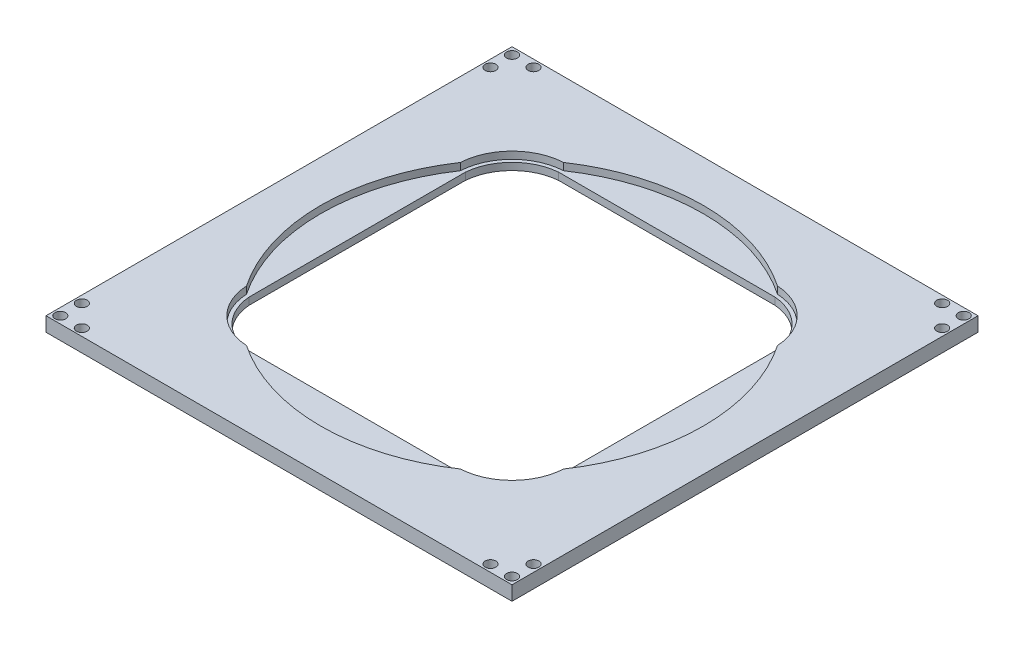
ISO-10303-21;
HEADER;
FILE_DESCRIPTION(('STEP AP214'),'2;1');
FILE_NAME('part.step','',(''),(''),'','','');
FILE_SCHEMA(('AUTOMOTIVE_DESIGN { 1 0 10303 214 1 1 1 1 }'));
ENDSEC;
DATA;
#1=APPLICATION_CONTEXT('core data for automotive mechanical design processes');
#2=APPLICATION_PROTOCOL_DEFINITION('international standard','automotive_design',2000,#1);
#3=PRODUCT_CONTEXT('',#1,'mechanical');
#4=PRODUCT('Part','Part','',(#3));
#5=PRODUCT_RELATED_PRODUCT_CATEGORY('part','',(#4));
#6=PRODUCT_DEFINITION_FORMATION('','',#4);
#7=PRODUCT_DEFINITION_CONTEXT('part definition',#1,'design');
#8=PRODUCT_DEFINITION('design','',#6,#7);
#9=PRODUCT_DEFINITION_SHAPE('','',#8);
#10=(LENGTH_UNIT() NAMED_UNIT(*) SI_UNIT(.MILLI.,.METRE.));
#11=(NAMED_UNIT(*) PLANE_ANGLE_UNIT() SI_UNIT($,.RADIAN.));
#12=(NAMED_UNIT(*) SI_UNIT($,.STERADIAN.) SOLID_ANGLE_UNIT());
#13=UNCERTAINTY_MEASURE_WITH_UNIT(LENGTH_MEASURE(1.E-05),#10,'distance_accuracy_value','');
#14=(GEOMETRIC_REPRESENTATION_CONTEXT(3) GLOBAL_UNCERTAINTY_ASSIGNED_CONTEXT((#13)) GLOBAL_UNIT_ASSIGNED_CONTEXT((#10,
#11,#12)) REPRESENTATION_CONTEXT('',''));
#15=CARTESIAN_POINT('',(0.,0.,0.));
#16=DIRECTION('',(0.,0.,1.));
#17=DIRECTION('',(1.,0.,0.));
#18=AXIS2_PLACEMENT_3D('',#15,#16,#17);
#19=CARTESIAN_POINT('',(65.,4.,-65.));
#20=DIRECTION('',(-1.,0.,0.));
#21=DIRECTION('',(0.,0.,1.));
#22=AXIS2_PLACEMENT_3D('',#19,#20,#21);
#23=PLANE('',#22);
#24=DIRECTION('',(0.,0.,-1.));
#25=VECTOR('',#24,1.);
#26=CARTESIAN_POINT('',(65.,0.,-65.));
#27=LINE('',#26,#25);
#28=CARTESIAN_POINT('',(65.,0.,65.));
#29=VERTEX_POINT('',#28);
#30=CARTESIAN_POINT('',(65.,0.,-65.));
#31=VERTEX_POINT('',#30);
#32=EDGE_CURVE('E307',#29,#31,#27,.T.);
#33=ORIENTED_EDGE('',*,*,#32,.T.);
#34=DIRECTION('',(0.,-1.,0.));
#35=VECTOR('',#34,1.);
#36=CARTESIAN_POINT('',(65.,4.,-65.));
#37=LINE('',#36,#35);
#38=CARTESIAN_POINT('',(65.,4.,-65.));
#39=VERTEX_POINT('',#38);
#40=EDGE_CURVE('E341',#39,#31,#37,.T.);
#41=ORIENTED_EDGE('',*,*,#40,.F.);
#42=DIRECTION('',(0.,0.,-1.));
#43=VECTOR('',#42,1.);
#44=CARTESIAN_POINT('',(65.,4.,-65.));
#45=LINE('',#44,#43);
#46=CARTESIAN_POINT('',(65.,4.,65.));
#47=VERTEX_POINT('',#46);
#48=EDGE_CURVE('E321',#47,#39,#45,.T.);
#49=ORIENTED_EDGE('',*,*,#48,.F.);
#50=DIRECTION('',(0.,-1.,0.));
#51=VECTOR('',#50,1.);
#52=CARTESIAN_POINT('',(65.,4.,65.));
#53=LINE('',#52,#51);
#54=EDGE_CURVE('E327',#47,#29,#53,.T.);
#55=ORIENTED_EDGE('',*,*,#54,.T.);
#56=EDGE_LOOP('',(#33,#41,#49,#55));
#57=FACE_BOUND('',#56,.T.);
#58=ADVANCED_FACE('F40',(#57),#23,.F.);
#59=CARTESIAN_POINT('',(-65.,4.,-65.));
#60=DIRECTION('',(0.,0.,1.));
#61=DIRECTION('',(1.,0.,0.));
#62=AXIS2_PLACEMENT_3D('',#59,#60,#61);
#63=PLANE('',#62);
#64=DIRECTION('',(-1.,0.,0.));
#65=VECTOR('',#64,1.);
#66=CARTESIAN_POINT('',(-65.,0.,-65.));
#67=LINE('',#66,#65);
#68=CARTESIAN_POINT('',(-65.,0.,-65.));
#69=VERTEX_POINT('',#68);
#70=EDGE_CURVE('E330',#31,#69,#67,.T.);
#71=ORIENTED_EDGE('',*,*,#70,.T.);
#72=DIRECTION('',(0.,-1.,0.));
#73=VECTOR('',#72,1.);
#74=CARTESIAN_POINT('',(-65.,4.,-65.));
#75=LINE('',#74,#73);
#76=CARTESIAN_POINT('',(-65.,4.,-65.));
#77=VERTEX_POINT('',#76);
#78=EDGE_CURVE('E338',#77,#69,#75,.T.);
#79=ORIENTED_EDGE('',*,*,#78,.F.);
#80=DIRECTION('',(-1.,0.,0.));
#81=VECTOR('',#80,1.);
#82=CARTESIAN_POINT('',(-65.,4.,-65.));
#83=LINE('',#82,#81);
#84=EDGE_CURVE('E91',#39,#77,#83,.T.);
#85=ORIENTED_EDGE('',*,*,#84,.F.);
#86=ORIENTED_EDGE('',*,*,#40,.T.);
#87=EDGE_LOOP('',(#71,#79,#85,#86));
#88=FACE_BOUND('',#87,.T.);
#89=ADVANCED_FACE('F387',(#88),#63,.F.);
#90=CARTESIAN_POINT('',(-65.,4.,-65.));
#91=DIRECTION('',(1.,0.,0.));
#92=DIRECTION('',(0.,0.,-1.));
#93=AXIS2_PLACEMENT_3D('',#90,#91,#92);
#94=PLANE('',#93);
#95=DIRECTION('',(0.,0.,1.));
#96=VECTOR('',#95,1.);
#97=CARTESIAN_POINT('',(-65.,0.,-65.));
#98=LINE('',#97,#96);
#99=CARTESIAN_POINT('',(-65.,0.,65.));
#100=VERTEX_POINT('',#99);
#101=EDGE_CURVE('E332',#69,#100,#98,.T.);
#102=ORIENTED_EDGE('',*,*,#101,.T.);
#103=DIRECTION('',(0.,-1.,0.));
#104=VECTOR('',#103,1.);
#105=CARTESIAN_POINT('',(-65.,4.,65.));
#106=LINE('',#105,#104);
#107=CARTESIAN_POINT('',(-65.,4.,65.));
#108=VERTEX_POINT('',#107);
#109=EDGE_CURVE('E336',#108,#100,#106,.T.);
#110=ORIENTED_EDGE('',*,*,#109,.F.);
#111=DIRECTION('',(0.,0.,1.));
#112=VECTOR('',#111,1.);
#113=CARTESIAN_POINT('',(-65.,4.,-65.));
#114=LINE('',#113,#112);
#115=EDGE_CURVE('E324',#77,#108,#114,.T.);
#116=ORIENTED_EDGE('',*,*,#115,.F.);
#117=ORIENTED_EDGE('',*,*,#78,.T.);
#118=EDGE_LOOP('',(#102,#110,#116,#117));
#119=FACE_BOUND('',#118,.T.);
#120=ADVANCED_FACE('F392',(#119),#94,.F.);
#121=CARTESIAN_POINT('',(-65.,4.,65.));
#122=DIRECTION('',(0.,0.,-1.));
#123=DIRECTION('',(-1.,0.,0.));
#124=AXIS2_PLACEMENT_3D('',#121,#122,#123);
#125=PLANE('',#124);
#126=DIRECTION('',(1.,0.,0.));
#127=VECTOR('',#126,1.);
#128=CARTESIAN_POINT('',(-65.,0.,65.));
#129=LINE('',#128,#127);
#130=EDGE_CURVE('E83',#100,#29,#129,.T.);
#131=ORIENTED_EDGE('',*,*,#130,.T.);
#132=ORIENTED_EDGE('',*,*,#54,.F.);
#133=DIRECTION('',(1.,0.,0.));
#134=VECTOR('',#133,1.);
#135=CARTESIAN_POINT('',(-65.,4.,65.));
#136=LINE('',#135,#134);
#137=EDGE_CURVE('E62',#108,#47,#136,.T.);
#138=ORIENTED_EDGE('',*,*,#137,.F.);
#139=ORIENTED_EDGE('',*,*,#109,.T.);
#140=EDGE_LOOP('',(#131,#132,#138,#139));
#141=FACE_BOUND('',#140,.T.);
#142=ADVANCED_FACE('F401',(#141),#125,.F.);
#143=CARTESIAN_POINT('',(0.,4.,0.));
#144=DIRECTION('',(0.,1.,0.));
#145=DIRECTION('',(0.,0.,1.));
#146=AXIS2_PLACEMENT_3D('',#143,#144,#145);
#147=PLANE('',#146);
#148=CARTESIAN_POINT('',(-62.9999999999998,4.,57.0000000000002));
#149=DIRECTION('',(0.,1.,0.));
#150=DIRECTION('',(1.,0.,0.));
#151=AXIS2_PLACEMENT_3D('',#148,#149,#150);
#152=CIRCLE('',#151,1.5);
#153=CARTESIAN_POINT('',(-61.4999999999998,4.,57.0000000000002));
#154=VERTEX_POINT('',#153);
#155=EDGE_CURVE('E713',#154,#154,#152,.T.);
#156=ORIENTED_EDGE('',*,*,#155,.F.);
#157=EDGE_LOOP('',(#156));
#158=FACE_BOUND('',#157,.T.);
#159=CARTESIAN_POINT('',(-56.9999999999998,4.,63.0000000000002));
#160=DIRECTION('',(0.,1.,0.));
#161=DIRECTION('',(1.,0.,0.));
#162=AXIS2_PLACEMENT_3D('',#159,#160,#161);
#163=CIRCLE('',#162,1.5);
#164=CARTESIAN_POINT('',(-55.4999999999998,4.,63.0000000000002));
#165=VERTEX_POINT('',#164);
#166=EDGE_CURVE('E719',#165,#165,#163,.T.);
#167=ORIENTED_EDGE('',*,*,#166,.F.);
#168=EDGE_LOOP('',(#167));
#169=FACE_BOUND('',#168,.T.);
#170=CARTESIAN_POINT('',(63.,4.,63.));
#171=DIRECTION('',(0.,1.,0.));
#172=DIRECTION('',(0.,0.,-1.));
#173=AXIS2_PLACEMENT_3D('',#170,#171,#172);
#174=CIRCLE('',#173,1.5);
#175=CARTESIAN_POINT('',(63.,4.,61.5));
#176=VERTEX_POINT('',#175);
#177=EDGE_CURVE('E728',#176,#176,#174,.T.);
#178=ORIENTED_EDGE('',*,*,#177,.F.);
#179=EDGE_LOOP('',(#178));
#180=FACE_BOUND('',#179,.T.);
#181=CARTESIAN_POINT('',(57.,4.,63.));
#182=DIRECTION('',(0.,1.,0.));
#183=DIRECTION('',(0.,0.,-1.));
#184=AXIS2_PLACEMENT_3D('',#181,#182,#183);
#185=CIRCLE('',#184,1.5);
#186=CARTESIAN_POINT('',(57.,4.,61.5));
#187=VERTEX_POINT('',#186);
#188=EDGE_CURVE('E734',#187,#187,#185,.T.);
#189=ORIENTED_EDGE('',*,*,#188,.F.);
#190=EDGE_LOOP('',(#189));
#191=FACE_BOUND('',#190,.T.);
#192=CARTESIAN_POINT('',(56.9999999999993,4.,-63.0000000000006));
#193=DIRECTION('',(0.,1.,0.));
#194=DIRECTION('',(-1.,0.,0.));
#195=AXIS2_PLACEMENT_3D('',#192,#193,#194);
#196=CIRCLE('',#195,1.5);
#197=CARTESIAN_POINT('',(55.4999999999993,4.,-63.0000000000006));
#198=VERTEX_POINT('',#197);
#199=EDGE_CURVE('E786',#198,#198,#196,.T.);
#200=ORIENTED_EDGE('',*,*,#199,.F.);
#201=EDGE_LOOP('',(#200));
#202=FACE_BOUND('',#201,.T.);
#203=CARTESIAN_POINT('',(62.9999999999994,4.,-57.0000000000007));
#204=DIRECTION('',(0.,1.,0.));
#205=DIRECTION('',(-1.,0.,0.));
#206=AXIS2_PLACEMENT_3D('',#203,#204,#205);
#207=CIRCLE('',#206,1.5);
#208=CARTESIAN_POINT('',(61.4999999999994,4.,-57.0000000000007));
#209=VERTEX_POINT('',#208);
#210=EDGE_CURVE('E796',#209,#209,#207,.T.);
#211=ORIENTED_EDGE('',*,*,#210,.F.);
#212=EDGE_LOOP('',(#211));
#213=FACE_BOUND('',#212,.T.);
#214=CARTESIAN_POINT('',(62.9999999999993,4.,-63.0000000000007));
#215=DIRECTION('',(0.,1.,0.));
#216=DIRECTION('',(-1.,0.,0.));
#217=AXIS2_PLACEMENT_3D('',#214,#215,#216);
#218=CIRCLE('',#217,1.5);
#219=CARTESIAN_POINT('',(61.4999999999993,4.,-63.0000000000007));
#220=VERTEX_POINT('',#219);
#221=EDGE_CURVE('E790',#220,#220,#218,.T.);
#222=ORIENTED_EDGE('',*,*,#221,.F.);
#223=EDGE_LOOP('',(#222));
#224=FACE_BOUND('',#223,.T.);
#225=CARTESIAN_POINT('',(63.,4.,57.));
#226=DIRECTION('',(0.,1.,0.));
#227=DIRECTION('',(0.,0.,-1.));
#228=AXIS2_PLACEMENT_3D('',#225,#226,#227);
#229=CIRCLE('',#228,1.5);
#230=CARTESIAN_POINT('',(63.,4.,55.5));
#231=VERTEX_POINT('',#230);
#232=EDGE_CURVE('E778',#231,#231,#229,.T.);
#233=ORIENTED_EDGE('',*,*,#232,.F.);
#234=EDGE_LOOP('',(#233));
#235=FACE_BOUND('',#234,.T.);
#236=CARTESIAN_POINT('',(-62.9999999999998,4.,63.0000000000002));
#237=DIRECTION('',(0.,1.,0.));
#238=DIRECTION('',(1.,0.,0.));
#239=AXIS2_PLACEMENT_3D('',#236,#237,#238);
#240=CIRCLE('',#239,1.5);
#241=CARTESIAN_POINT('',(-61.4999999999998,4.,63.0000000000002));
#242=VERTEX_POINT('',#241);
#243=EDGE_CURVE('E716',#242,#242,#240,.T.);
#244=ORIENTED_EDGE('',*,*,#243,.F.);
#245=EDGE_LOOP('',(#244));
#246=FACE_BOUND('',#245,.T.);
#247=CARTESIAN_POINT('',(-63.,4.,-57.));
#248=DIRECTION('',(0.,1.,0.));
#249=DIRECTION('',(0.,0.,1.));
#250=AXIS2_PLACEMENT_3D('',#247,#248,#249);
#251=CIRCLE('',#250,1.5);
#252=CARTESIAN_POINT('',(-63.,4.,-55.5));
#253=VERTEX_POINT('',#252);
#254=EDGE_CURVE('E741',#253,#253,#251,.T.);
#255=ORIENTED_EDGE('',*,*,#254,.F.);
#256=EDGE_LOOP('',(#255));
#257=FACE_BOUND('',#256,.T.);
#258=CARTESIAN_POINT('',(-57.,4.,-63.));
#259=DIRECTION('',(0.,1.,0.));
#260=DIRECTION('',(0.,0.,1.));
#261=AXIS2_PLACEMENT_3D('',#258,#259,#260);
#262=CIRCLE('',#261,1.5);
#263=CARTESIAN_POINT('',(-57.,4.,-61.5));
#264=VERTEX_POINT('',#263);
#265=EDGE_CURVE('E747',#264,#264,#262,.T.);
#266=ORIENTED_EDGE('',*,*,#265,.F.);
#267=EDGE_LOOP('',(#266));
#268=FACE_BOUND('',#267,.T.);
#269=CARTESIAN_POINT('',(-63.,4.,-63.));
#270=DIRECTION('',(0.,1.,0.));
#271=DIRECTION('',(0.,0.,1.));
#272=AXIS2_PLACEMENT_3D('',#269,#270,#271);
#273=CIRCLE('',#272,1.5);
#274=CARTESIAN_POINT('',(-63.,4.,-61.5));
#275=VERTEX_POINT('',#274);
#276=EDGE_CURVE('E219',#275,#275,#273,.T.);
#277=ORIENTED_EDGE('',*,*,#276,.F.);
#278=EDGE_LOOP('',(#277));
#279=FACE_BOUND('',#278,.T.);
#280=CARTESIAN_POINT('',(28.9999999999999,4.,-29.));
#281=DIRECTION('',(0.,1.,0.));
#282=DIRECTION('',(0.,0.,1.));
#283=AXIS2_PLACEMENT_3D('',#280,#281,#282);
#284=CIRCLE('',#283,15.25);
#285=CARTESIAN_POINT('',(44.2270660839662,4.,-29.8360373643096));
#286=VERTEX_POINT('',#285);
#287=CARTESIAN_POINT('',(29.8360373643095,4.,-44.2270660839664));
#288=VERTEX_POINT('',#287);
#289=EDGE_CURVE('E283',#286,#288,#284,.T.);
#290=ORIENTED_EDGE('',*,*,#289,.F.);
#291=CARTESIAN_POINT('',(0.,4.,0.));
#292=DIRECTION('',(0.,1.,0.));
#293=DIRECTION('',(0.,0.,1.));
#294=AXIS2_PLACEMENT_3D('',#291,#292,#293);
#295=CIRCLE('',#294,53.35);
#296=CARTESIAN_POINT('',(44.2270660839663,4.,29.8360373643095));
#297=VERTEX_POINT('',#296);
#298=EDGE_CURVE('E302',#297,#286,#295,.T.);
#299=ORIENTED_EDGE('',*,*,#298,.F.);
#300=CARTESIAN_POINT('',(29.,4.,28.9999999999998));
#301=DIRECTION('',(0.,1.,0.));
#302=DIRECTION('',(0.,0.,1.));
#303=AXIS2_PLACEMENT_3D('',#300,#301,#302);
#304=CIRCLE('',#303,15.25);
#305=CARTESIAN_POINT('',(29.8360373643098,4.,44.2270660839661));
#306=VERTEX_POINT('',#305);
#307=EDGE_CURVE('E299',#306,#297,#304,.T.);
#308=ORIENTED_EDGE('',*,*,#307,.F.);
#309=CARTESIAN_POINT('',(0.,4.,0.));
#310=DIRECTION('',(0.,1.,0.));
#311=DIRECTION('',(0.,0.,1.));
#312=AXIS2_PLACEMENT_3D('',#309,#310,#311);
#313=CIRCLE('',#312,53.35);
#314=CARTESIAN_POINT('',(-29.8360373643098,4.,44.2270660839662));
#315=VERTEX_POINT('',#314);
#316=EDGE_CURVE('E296',#315,#306,#313,.T.);
#317=ORIENTED_EDGE('',*,*,#316,.F.);
#318=CARTESIAN_POINT('',(-29.,4.,28.9999999999998));
#319=DIRECTION('',(0.,1.,0.));
#320=DIRECTION('',(0.,0.,1.));
#321=AXIS2_PLACEMENT_3D('',#318,#319,#320);
#322=CIRCLE('',#321,15.25);
#323=CARTESIAN_POINT('',(-44.2270660839664,4.,29.8360373643095));
#324=VERTEX_POINT('',#323);
#325=EDGE_CURVE('E293',#324,#315,#322,.T.);
#326=ORIENTED_EDGE('',*,*,#325,.F.);
#327=CARTESIAN_POINT('',(0.,4.,0.));
#328=DIRECTION('',(0.,1.,0.));
#329=DIRECTION('',(0.,0.,1.));
#330=AXIS2_PLACEMENT_3D('',#327,#328,#329);
#331=CIRCLE('',#330,53.35);
#332=CARTESIAN_POINT('',(-44.2270660839665,4.,-29.8360373643094));
#333=VERTEX_POINT('',#332);
#334=EDGE_CURVE('E290',#333,#324,#331,.T.);
#335=ORIENTED_EDGE('',*,*,#334,.F.);
#336=CARTESIAN_POINT('',(-29.0000000000001,4.,-29.));
#337=DIRECTION('',(0.,1.,0.));
#338=DIRECTION('',(0.,0.,1.));
#339=AXIS2_PLACEMENT_3D('',#336,#337,#338);
#340=CIRCLE('',#339,15.25);
#341=CARTESIAN_POINT('',(-29.8360373643095,4.,-44.2270660839664));
#342=VERTEX_POINT('',#341);
#343=EDGE_CURVE('E287',#342,#333,#340,.T.);
#344=ORIENTED_EDGE('',*,*,#343,.F.);
#345=CARTESIAN_POINT('',(0.,4.,0.));
#346=DIRECTION('',(0.,1.,0.));
#347=DIRECTION('',(0.,0.,1.));
#348=AXIS2_PLACEMENT_3D('',#345,#346,#347);
#349=CIRCLE('',#348,53.35);
#350=EDGE_CURVE('E285',#288,#342,#349,.T.);
#351=ORIENTED_EDGE('',*,*,#350,.F.);
#352=EDGE_LOOP('',(#290,#299,#308,#317,#326,#335,#344,#351));
#353=FACE_BOUND('',#352,.T.);
#354=ORIENTED_EDGE('',*,*,#48,.T.);
#355=ORIENTED_EDGE('',*,*,#84,.T.);
#356=ORIENTED_EDGE('',*,*,#115,.T.);
#357=ORIENTED_EDGE('',*,*,#137,.T.);
#358=EDGE_LOOP('',(#354,#355,#356,#357));
#359=FACE_BOUND('',#358,.T.);
#360=ADVANCED_FACE('F359',(#158,#169,#180,#191,#202,#213,#224,#235,#246,#257,#268,#279,#353,
#359),#147,.T.);
#361=CARTESIAN_POINT('',(0.,0.,0.));
#362=DIRECTION('',(0.,1.,0.));
#363=DIRECTION('',(0.,0.,1.));
#364=AXIS2_PLACEMENT_3D('',#361,#362,#363);
#365=PLANE('',#364);
#366=CARTESIAN_POINT('',(-62.9999999999998,0.,57.0000000000002));
#367=DIRECTION('',(0.,1.,0.));
#368=DIRECTION('',(1.,0.,0.));
#369=AXIS2_PLACEMENT_3D('',#366,#367,#368);
#370=CIRCLE('',#369,1.5);
#371=CARTESIAN_POINT('',(-61.4999999999998,0.,57.0000000000002));
#372=VERTEX_POINT('',#371);
#373=EDGE_CURVE('E711',#372,#372,#370,.T.);
#374=ORIENTED_EDGE('',*,*,#373,.T.);
#375=EDGE_LOOP('',(#374));
#376=FACE_BOUND('',#375,.T.);
#377=CARTESIAN_POINT('',(-56.9999999999998,0.,63.0000000000002));
#378=DIRECTION('',(0.,1.,0.));
#379=DIRECTION('',(1.,0.,0.));
#380=AXIS2_PLACEMENT_3D('',#377,#378,#379);
#381=CIRCLE('',#380,1.5);
#382=CARTESIAN_POINT('',(-55.4999999999998,0.,63.0000000000002));
#383=VERTEX_POINT('',#382);
#384=EDGE_CURVE('E714',#383,#383,#381,.T.);
#385=ORIENTED_EDGE('',*,*,#384,.T.);
#386=EDGE_LOOP('',(#385));
#387=FACE_BOUND('',#386,.T.);
#388=CARTESIAN_POINT('',(63.,0.,63.));
#389=DIRECTION('',(0.,1.,0.));
#390=DIRECTION('',(0.,0.,-1.));
#391=AXIS2_PLACEMENT_3D('',#388,#389,#390);
#392=CIRCLE('',#391,1.5);
#393=CARTESIAN_POINT('',(63.,0.,61.5));
#394=VERTEX_POINT('',#393);
#395=EDGE_CURVE('E725',#394,#394,#392,.T.);
#396=ORIENTED_EDGE('',*,*,#395,.T.);
#397=EDGE_LOOP('',(#396));
#398=FACE_BOUND('',#397,.T.);
#399=CARTESIAN_POINT('',(57.,0.,63.));
#400=DIRECTION('',(0.,1.,0.));
#401=DIRECTION('',(0.,0.,-1.));
#402=AXIS2_PLACEMENT_3D('',#399,#400,#401);
#403=CIRCLE('',#402,1.5);
#404=CARTESIAN_POINT('',(57.,0.,61.5));
#405=VERTEX_POINT('',#404);
#406=EDGE_CURVE('E731',#405,#405,#403,.T.);
#407=ORIENTED_EDGE('',*,*,#406,.T.);
#408=EDGE_LOOP('',(#407));
#409=FACE_BOUND('',#408,.T.);
#410=CARTESIAN_POINT('',(56.9999999999993,0.,-63.0000000000006));
#411=DIRECTION('',(0.,1.,0.));
#412=DIRECTION('',(-1.,0.,0.));
#413=AXIS2_PLACEMENT_3D('',#410,#411,#412);
#414=CIRCLE('',#413,1.5);
#415=CARTESIAN_POINT('',(55.4999999999993,0.,-63.0000000000006));
#416=VERTEX_POINT('',#415);
#417=EDGE_CURVE('E801',#416,#416,#414,.T.);
#418=ORIENTED_EDGE('',*,*,#417,.T.);
#419=EDGE_LOOP('',(#418));
#420=FACE_BOUND('',#419,.T.);
#421=CARTESIAN_POINT('',(62.9999999999994,0.,-57.0000000000007));
#422=DIRECTION('',(0.,1.,0.));
#423=DIRECTION('',(-1.,0.,0.));
#424=AXIS2_PLACEMENT_3D('',#421,#422,#423);
#425=CIRCLE('',#424,1.5);
#426=CARTESIAN_POINT('',(61.4999999999994,0.,-57.0000000000007));
#427=VERTEX_POINT('',#426);
#428=EDGE_CURVE('E792',#427,#427,#425,.T.);
#429=ORIENTED_EDGE('',*,*,#428,.T.);
#430=EDGE_LOOP('',(#429));
#431=FACE_BOUND('',#430,.T.);
#432=CARTESIAN_POINT('',(62.9999999999993,0.,-63.0000000000007));
#433=DIRECTION('',(0.,1.,0.));
#434=DIRECTION('',(-1.,0.,0.));
#435=AXIS2_PLACEMENT_3D('',#432,#433,#434);
#436=CIRCLE('',#435,1.5);
#437=CARTESIAN_POINT('',(61.4999999999993,0.,-63.0000000000007));
#438=VERTEX_POINT('',#437);
#439=EDGE_CURVE('E783',#438,#438,#436,.T.);
#440=ORIENTED_EDGE('',*,*,#439,.T.);
#441=EDGE_LOOP('',(#440));
#442=FACE_BOUND('',#441,.T.);
#443=CARTESIAN_POINT('',(63.,0.,57.));
#444=DIRECTION('',(0.,1.,0.));
#445=DIRECTION('',(0.,0.,-1.));
#446=AXIS2_PLACEMENT_3D('',#443,#444,#445);
#447=CIRCLE('',#446,1.5);
#448=CARTESIAN_POINT('',(63.,0.,55.5));
#449=VERTEX_POINT('',#448);
#450=EDGE_CURVE('E737',#449,#449,#447,.T.);
#451=ORIENTED_EDGE('',*,*,#450,.T.);
#452=EDGE_LOOP('',(#451));
#453=FACE_BOUND('',#452,.T.);
#454=CARTESIAN_POINT('',(-62.9999999999998,0.,63.0000000000002));
#455=DIRECTION('',(0.,1.,0.));
#456=DIRECTION('',(1.,0.,0.));
#457=AXIS2_PLACEMENT_3D('',#454,#455,#456);
#458=CIRCLE('',#457,1.5);
#459=CARTESIAN_POINT('',(-61.4999999999998,0.,63.0000000000002));
#460=VERTEX_POINT('',#459);
#461=EDGE_CURVE('E738',#460,#460,#458,.T.);
#462=ORIENTED_EDGE('',*,*,#461,.T.);
#463=EDGE_LOOP('',(#462));
#464=FACE_BOUND('',#463,.T.);
#465=CARTESIAN_POINT('',(-63.,0.,-57.));
#466=DIRECTION('',(0.,1.,0.));
#467=DIRECTION('',(0.,0.,1.));
#468=AXIS2_PLACEMENT_3D('',#465,#466,#467);
#469=CIRCLE('',#468,1.5);
#470=CARTESIAN_POINT('',(-63.,0.,-55.5));
#471=VERTEX_POINT('',#470);
#472=EDGE_CURVE('E750',#471,#471,#469,.T.);
#473=ORIENTED_EDGE('',*,*,#472,.T.);
#474=EDGE_LOOP('',(#473));
#475=FACE_BOUND('',#474,.T.);
#476=CARTESIAN_POINT('',(-57.,0.,-63.));
#477=DIRECTION('',(0.,1.,0.));
#478=DIRECTION('',(0.,0.,1.));
#479=AXIS2_PLACEMENT_3D('',#476,#477,#478);
#480=CIRCLE('',#479,1.5);
#481=CARTESIAN_POINT('',(-57.,0.,-61.5));
#482=VERTEX_POINT('',#481);
#483=EDGE_CURVE('E744',#482,#482,#480,.T.);
#484=ORIENTED_EDGE('',*,*,#483,.T.);
#485=EDGE_LOOP('',(#484));
#486=FACE_BOUND('',#485,.T.);
#487=CARTESIAN_POINT('',(-63.,0.,-63.));
#488=DIRECTION('',(0.,1.,0.));
#489=DIRECTION('',(0.,0.,1.));
#490=AXIS2_PLACEMENT_3D('',#487,#488,#489);
#491=CIRCLE('',#490,1.5);
#492=CARTESIAN_POINT('',(-63.,0.,-61.5));
#493=VERTEX_POINT('',#492);
#494=EDGE_CURVE('E214',#493,#493,#491,.T.);
#495=ORIENTED_EDGE('',*,*,#494,.T.);
#496=EDGE_LOOP('',(#495));
#497=FACE_BOUND('',#496,.T.);
#498=CARTESIAN_POINT('',(-29.,0.,28.9999999999998));
#499=DIRECTION('',(0.,1.,0.));
#500=DIRECTION('',(0.,0.,1.));
#501=AXIS2_PLACEMENT_3D('',#498,#499,#500);
#502=CIRCLE('',#501,14.2379176797096);
#503=CARTESIAN_POINT('',(-43.1898464071789,0.,30.1689990568263));
#504=VERTEX_POINT('',#503);
#505=CARTESIAN_POINT('',(-30.1689990568201,0.,43.1898464071792));
#506=VERTEX_POINT('',#505);
#507=EDGE_CURVE('E231',#504,#506,#502,.T.);
#508=ORIENTED_EDGE('',*,*,#507,.T.);
#509=DIRECTION('',(1.,0.,0.));
#510=VECTOR('',#509,1.);
#511=CARTESIAN_POINT('',(-30.1689990568259,0.,43.1898464071792));
#512=LINE('',#511,#510);
#513=CARTESIAN_POINT('',(30.1689990568258,0.,43.1898464071792));
#514=VERTEX_POINT('',#513);
#515=EDGE_CURVE('E268',#506,#514,#512,.T.);
#516=ORIENTED_EDGE('',*,*,#515,.T.);
#517=CARTESIAN_POINT('',(28.9999999999999,0.,28.9999999999999));
#518=DIRECTION('',(0.,1.,0.));
#519=DIRECTION('',(1.,0.,0.));
#520=AXIS2_PLACEMENT_3D('',#517,#518,#519);
#521=CIRCLE('',#520,14.2379176797096);
#522=CARTESIAN_POINT('',(43.1898464071793,0.,30.16899905682));
#523=VERTEX_POINT('',#522);
#524=EDGE_CURVE('E226',#514,#523,#521,.T.);
#525=ORIENTED_EDGE('',*,*,#524,.T.);
#526=DIRECTION('',(0.,0.,-1.));
#527=VECTOR('',#526,1.);
#528=CARTESIAN_POINT('',(43.1898464071793,0.,30.1689990568257));
#529=LINE('',#528,#527);
#530=CARTESIAN_POINT('',(43.1898464071791,0.,-30.168999056826));
#531=VERTEX_POINT('',#530);
#532=EDGE_CURVE('E252',#523,#531,#529,.T.);
#533=ORIENTED_EDGE('',*,*,#532,.T.);
#534=CARTESIAN_POINT('',(29.,0.,-28.9999999999998));
#535=DIRECTION('',(0.,1.,0.));
#536=DIRECTION('',(0.,0.,-1.));
#537=AXIS2_PLACEMENT_3D('',#534,#535,#536);
#538=CIRCLE('',#537,14.2379176797096);
#539=CARTESIAN_POINT('',(30.1689990568201,0.,-43.1898464071792));
#540=VERTEX_POINT('',#539);
#541=EDGE_CURVE('E216',#531,#540,#538,.T.);
#542=ORIENTED_EDGE('',*,*,#541,.T.);
#543=DIRECTION('',(-1.,0.,0.));
#544=VECTOR('',#543,1.);
#545=CARTESIAN_POINT('',(30.1689990568259,0.,-43.1898464071792));
#546=LINE('',#545,#544);
#547=CARTESIAN_POINT('',(-30.1689990568258,0.,-43.1898464071792));
#548=VERTEX_POINT('',#547);
#549=EDGE_CURVE('E213',#540,#548,#546,.T.);
#550=ORIENTED_EDGE('',*,*,#549,.T.);
#551=CARTESIAN_POINT('',(-29.0000000000001,0.,-28.9999999999997));
#552=DIRECTION('',(0.,1.,0.));
#553=DIRECTION('',(-1.,0.,0.));
#554=AXIS2_PLACEMENT_3D('',#551,#552,#553);
#555=CIRCLE('',#554,14.2379176797096);
#556=CARTESIAN_POINT('',(-43.1898464071795,0.,-30.1689990568197));
#557=VERTEX_POINT('',#556);
#558=EDGE_CURVE('E205',#548,#557,#555,.T.);
#559=ORIENTED_EDGE('',*,*,#558,.T.);
#560=DIRECTION('',(0.,0.,1.));
#561=VECTOR('',#560,1.);
#562=CARTESIAN_POINT('',(-43.1898464071795,0.,-30.1689990568254));
#563=LINE('',#562,#561);
#564=EDGE_CURVE('E187',#557,#504,#563,.T.);
#565=ORIENTED_EDGE('',*,*,#564,.T.);
#566=EDGE_LOOP('',(#508,#516,#525,#533,#542,#550,#559,#565));
#567=FACE_BOUND('',#566,.T.);
#568=ORIENTED_EDGE('',*,*,#32,.F.);
#569=ORIENTED_EDGE('',*,*,#130,.F.);
#570=ORIENTED_EDGE('',*,*,#101,.F.);
#571=ORIENTED_EDGE('',*,*,#70,.F.);
#572=EDGE_LOOP('',(#568,#569,#570,#571));
#573=FACE_BOUND('',#572,.T.);
#574=ADVANCED_FACE('F210',(#376,#387,#398,#409,#420,#431,#442,#453,#464,#475,#486,#497,#567,
#573),#365,.F.);
#575=CARTESIAN_POINT('',(28.9999999999999,0.,-29.));
#576=DIRECTION('',(0.,1.,0.));
#577=DIRECTION('',(0.,0.,1.));
#578=AXIS2_PLACEMENT_3D('',#575,#576,#577);
#579=CYLINDRICAL_SURFACE('',#578,15.25);
#580=DIRECTION('',(0.,1.,0.));
#581=VECTOR('',#580,1.);
#582=CARTESIAN_POINT('',(29.8360373643095,0.,-44.2270660839664));
#583=LINE('',#582,#581);
#584=CARTESIAN_POINT('',(29.8360373643095,2.,-44.2270660839664));
#585=VERTEX_POINT('',#584);
#586=EDGE_CURVE('E53',#585,#288,#583,.T.);
#587=ORIENTED_EDGE('',*,*,#586,.F.);
#588=CARTESIAN_POINT('',(28.9999999999999,2.,-29.));
#589=DIRECTION('',(0.,1.,0.));
#590=DIRECTION('',(0.,0.,1.));
#591=AXIS2_PLACEMENT_3D('',#588,#589,#590);
#592=CIRCLE('',#591,15.25);
#593=CARTESIAN_POINT('',(44.2270660839662,2.,-29.8360373643096));
#594=VERTEX_POINT('',#593);
#595=EDGE_CURVE('E265',#585,#594,#592,.F.);
#596=ORIENTED_EDGE('',*,*,#595,.T.);
#597=DIRECTION('',(0.,1.,0.));
#598=VECTOR('',#597,1.);
#599=CARTESIAN_POINT('',(44.2270660839662,0.,-29.8360373643096));
#600=LINE('',#599,#598);
#601=EDGE_CURVE('E305',#594,#286,#600,.T.);
#602=ORIENTED_EDGE('',*,*,#601,.T.);
#603=ORIENTED_EDGE('',*,*,#289,.T.);
#604=EDGE_LOOP('',(#587,#596,#602,#603));
#605=FACE_BOUND('',#604,.T.);
#606=ADVANCED_FACE('F372',(#605),#579,.F.);
#607=CARTESIAN_POINT('',(0.,0.,0.));
#608=DIRECTION('',(0.,1.,0.));
#609=DIRECTION('',(0.,0.,1.));
#610=AXIS2_PLACEMENT_3D('',#607,#608,#609);
#611=CYLINDRICAL_SURFACE('',#610,53.35);
#612=ORIENTED_EDGE('',*,*,#601,.F.);
#613=CARTESIAN_POINT('',(0.,2.,0.));
#614=DIRECTION('',(0.,1.,0.));
#615=DIRECTION('',(0.,0.,1.));
#616=AXIS2_PLACEMENT_3D('',#613,#614,#615);
#617=CIRCLE('',#616,53.35);
#618=CARTESIAN_POINT('',(44.2270660839664,2.,29.8360373643095));
#619=VERTEX_POINT('',#618);
#620=EDGE_CURVE('E260',#594,#619,#617,.F.);
#621=ORIENTED_EDGE('',*,*,#620,.T.);
#622=DIRECTION('',(0.,1.,0.));
#623=VECTOR('',#622,1.);
#624=CARTESIAN_POINT('',(44.2270660839663,0.,29.8360373643095));
#625=LINE('',#624,#623);
#626=EDGE_CURVE('E308',#619,#297,#625,.T.);
#627=ORIENTED_EDGE('',*,*,#626,.T.);
#628=ORIENTED_EDGE('',*,*,#298,.T.);
#629=EDGE_LOOP('',(#612,#621,#627,#628));
#630=FACE_BOUND('',#629,.T.);
#631=ADVANCED_FACE('F370',(#630),#611,.F.);
#632=CARTESIAN_POINT('',(29.,0.,28.9999999999998));
#633=DIRECTION('',(0.,1.,0.));
#634=DIRECTION('',(0.,0.,1.));
#635=AXIS2_PLACEMENT_3D('',#632,#633,#634);
#636=CYLINDRICAL_SURFACE('',#635,15.25);
#637=ORIENTED_EDGE('',*,*,#626,.F.);
#638=CARTESIAN_POINT('',(29.,2.,28.9999999999998));
#639=DIRECTION('',(0.,1.,0.));
#640=DIRECTION('',(0.,0.,1.));
#641=AXIS2_PLACEMENT_3D('',#638,#639,#640);
#642=CIRCLE('',#641,15.25);
#643=CARTESIAN_POINT('',(29.8360373643098,2.,44.2270660839661));
#644=VERTEX_POINT('',#643);
#645=EDGE_CURVE('E280',#619,#644,#642,.F.);
#646=ORIENTED_EDGE('',*,*,#645,.T.);
#647=DIRECTION('',(0.,1.,0.));
#648=VECTOR('',#647,1.);
#649=CARTESIAN_POINT('',(29.8360373643098,0.,44.2270660839661));
#650=LINE('',#649,#648);
#651=EDGE_CURVE('E310',#644,#306,#650,.T.);
#652=ORIENTED_EDGE('',*,*,#651,.T.);
#653=ORIENTED_EDGE('',*,*,#307,.T.);
#654=EDGE_LOOP('',(#637,#646,#652,#653));
#655=FACE_BOUND('',#654,.T.);
#656=ADVANCED_FACE('F367',(#655),#636,.F.);
#657=CARTESIAN_POINT('',(0.,0.,0.));
#658=DIRECTION('',(0.,1.,0.));
#659=DIRECTION('',(0.,0.,1.));
#660=AXIS2_PLACEMENT_3D('',#657,#658,#659);
#661=CYLINDRICAL_SURFACE('',#660,53.35);
#662=ORIENTED_EDGE('',*,*,#651,.F.);
#663=CARTESIAN_POINT('',(0.,2.,0.));
#664=DIRECTION('',(0.,1.,0.));
#665=DIRECTION('',(0.,0.,1.));
#666=AXIS2_PLACEMENT_3D('',#663,#664,#665);
#667=CIRCLE('',#666,53.35);
#668=CARTESIAN_POINT('',(-29.8360373643098,2.,44.2270660839662));
#669=VERTEX_POINT('',#668);
#670=EDGE_CURVE('E276',#644,#669,#667,.F.);
#671=ORIENTED_EDGE('',*,*,#670,.T.);
#672=DIRECTION('',(0.,1.,0.));
#673=VECTOR('',#672,1.);
#674=CARTESIAN_POINT('',(-29.8360373643098,0.,44.2270660839662));
#675=LINE('',#674,#673);
#676=EDGE_CURVE('E312',#669,#315,#675,.T.);
#677=ORIENTED_EDGE('',*,*,#676,.T.);
#678=ORIENTED_EDGE('',*,*,#316,.T.);
#679=EDGE_LOOP('',(#662,#671,#677,#678));
#680=FACE_BOUND('',#679,.T.);
#681=ADVANCED_FACE('F364',(#680),#661,.F.);
#682=CARTESIAN_POINT('',(-29.,0.,28.9999999999998));
#683=DIRECTION('',(0.,1.,0.));
#684=DIRECTION('',(0.,0.,1.));
#685=AXIS2_PLACEMENT_3D('',#682,#683,#684);
#686=CYLINDRICAL_SURFACE('',#685,15.25);
#687=CARTESIAN_POINT('',(-29.,2.,28.9999999999998));
#688=DIRECTION('',(0.,1.,0.));
#689=DIRECTION('',(0.,0.,1.));
#690=AXIS2_PLACEMENT_3D('',#687,#688,#689);
#691=CIRCLE('',#690,15.25);
#692=CARTESIAN_POINT('',(-44.2270660839664,2.,29.8360373643095));
#693=VERTEX_POINT('',#692);
#694=EDGE_CURVE('E47',#669,#693,#691,.F.);
#695=ORIENTED_EDGE('',*,*,#694,.T.);
#696=DIRECTION('',(0.,1.,0.));
#697=VECTOR('',#696,1.);
#698=CARTESIAN_POINT('',(-44.2270660839664,0.,29.8360373643095));
#699=LINE('',#698,#697);
#700=EDGE_CURVE('E314',#693,#324,#699,.T.);
#701=ORIENTED_EDGE('',*,*,#700,.T.);
#702=ORIENTED_EDGE('',*,*,#325,.T.);
#703=ORIENTED_EDGE('',*,*,#676,.F.);
#704=EDGE_LOOP('',(#695,#701,#702,#703));
#705=FACE_BOUND('',#704,.T.);
#706=ADVANCED_FACE('F345',(#705),#686,.F.);
#707=CARTESIAN_POINT('',(0.,0.,0.));
#708=DIRECTION('',(0.,1.,0.));
#709=DIRECTION('',(0.,0.,1.));
#710=AXIS2_PLACEMENT_3D('',#707,#708,#709);
#711=CYLINDRICAL_SURFACE('',#710,53.35);
#712=ORIENTED_EDGE('',*,*,#700,.F.);
#713=CARTESIAN_POINT('',(0.,2.,0.));
#714=DIRECTION('',(0.,1.,0.));
#715=DIRECTION('',(0.,0.,1.));
#716=AXIS2_PLACEMENT_3D('',#713,#714,#715);
#717=CIRCLE('',#716,53.35);
#718=CARTESIAN_POINT('',(-44.2270660839665,2.,-29.8360373643094));
#719=VERTEX_POINT('',#718);
#720=EDGE_CURVE('E237',#693,#719,#717,.F.);
#721=ORIENTED_EDGE('',*,*,#720,.T.);
#722=DIRECTION('',(0.,1.,0.));
#723=VECTOR('',#722,1.);
#724=CARTESIAN_POINT('',(-44.2270660839665,0.,-29.8360373643094));
#725=LINE('',#724,#723);
#726=EDGE_CURVE('E316',#719,#333,#725,.T.);
#727=ORIENTED_EDGE('',*,*,#726,.T.);
#728=ORIENTED_EDGE('',*,*,#334,.T.);
#729=EDGE_LOOP('',(#712,#721,#727,#728));
#730=FACE_BOUND('',#729,.T.);
#731=ADVANCED_FACE('F352',(#730),#711,.F.);
#732=CARTESIAN_POINT('',(-29.0000000000001,0.,-29.));
#733=DIRECTION('',(0.,1.,0.));
#734=DIRECTION('',(0.,0.,1.));
#735=AXIS2_PLACEMENT_3D('',#732,#733,#734);
#736=CYLINDRICAL_SURFACE('',#735,15.25);
#737=ORIENTED_EDGE('',*,*,#726,.F.);
#738=CARTESIAN_POINT('',(-29.0000000000001,2.,-29.));
#739=DIRECTION('',(0.,1.,0.));
#740=DIRECTION('',(0.,0.,1.));
#741=AXIS2_PLACEMENT_3D('',#738,#739,#740);
#742=CIRCLE('',#741,15.25);
#743=CARTESIAN_POINT('',(-29.8360373643095,2.,-44.2270660839664));
#744=VERTEX_POINT('',#743);
#745=EDGE_CURVE('E247',#719,#744,#742,.F.);
#746=ORIENTED_EDGE('',*,*,#745,.T.);
#747=DIRECTION('',(0.,1.,0.));
#748=VECTOR('',#747,1.);
#749=CARTESIAN_POINT('',(-29.8360373643095,0.,-44.2270660839664));
#750=LINE('',#749,#748);
#751=EDGE_CURVE('E318',#744,#342,#750,.T.);
#752=ORIENTED_EDGE('',*,*,#751,.T.);
#753=ORIENTED_EDGE('',*,*,#343,.T.);
#754=EDGE_LOOP('',(#737,#746,#752,#753));
#755=FACE_BOUND('',#754,.T.);
#756=ADVANCED_FACE('F377',(#755),#736,.F.);
#757=CARTESIAN_POINT('',(0.,0.,0.));
#758=DIRECTION('',(0.,1.,0.));
#759=DIRECTION('',(0.,0.,1.));
#760=AXIS2_PLACEMENT_3D('',#757,#758,#759);
#761=CYLINDRICAL_SURFACE('',#760,53.35);
#762=ORIENTED_EDGE('',*,*,#751,.F.);
#763=CARTESIAN_POINT('',(0.,2.,0.));
#764=DIRECTION('',(0.,1.,0.));
#765=DIRECTION('',(0.,0.,1.));
#766=AXIS2_PLACEMENT_3D('',#763,#764,#765);
#767=CIRCLE('',#766,53.35);
#768=EDGE_CURVE('E11',#744,#585,#767,.F.);
#769=ORIENTED_EDGE('',*,*,#768,.T.);
#770=ORIENTED_EDGE('',*,*,#586,.T.);
#771=ORIENTED_EDGE('',*,*,#350,.T.);
#772=EDGE_LOOP('',(#762,#769,#770,#771));
#773=FACE_BOUND('',#772,.T.);
#774=ADVANCED_FACE('F375',(#773),#761,.F.);
#775=CARTESIAN_POINT('',(0.,2.,0.));
#776=DIRECTION('',(0.,1.,0.));
#777=DIRECTION('',(0.,0.,1.));
#778=AXIS2_PLACEMENT_3D('',#775,#776,#777);
#779=PLANE('',#778);
#780=ORIENTED_EDGE('',*,*,#745,.F.);
#781=ORIENTED_EDGE('',*,*,#720,.F.);
#782=ORIENTED_EDGE('',*,*,#694,.F.);
#783=ORIENTED_EDGE('',*,*,#670,.F.);
#784=ORIENTED_EDGE('',*,*,#645,.F.);
#785=ORIENTED_EDGE('',*,*,#620,.F.);
#786=ORIENTED_EDGE('',*,*,#595,.F.);
#787=ORIENTED_EDGE('',*,*,#768,.F.);
#788=EDGE_LOOP('',(#780,#781,#782,#783,#784,#785,#786,#787));
#789=FACE_BOUND('',#788,.T.);
#790=CARTESIAN_POINT('',(-29.0000000000001,2.,-28.9999999999997));
#791=DIRECTION('',(0.,1.,0.));
#792=DIRECTION('',(-1.,0.,0.));
#793=AXIS2_PLACEMENT_3D('',#790,#791,#792);
#794=CIRCLE('',#793,14.2379176797096);
#795=CARTESIAN_POINT('',(-30.1689990568258,2.,-43.1898464071792));
#796=VERTEX_POINT('',#795);
#797=CARTESIAN_POINT('',(-43.1898464071795,2.,-30.1689990568254));
#798=VERTEX_POINT('',#797);
#799=EDGE_CURVE('E207',#796,#798,#794,.T.);
#800=ORIENTED_EDGE('',*,*,#799,.F.);
#801=DIRECTION('',(-1.,0.,0.));
#802=VECTOR('',#801,1.);
#803=CARTESIAN_POINT('',(30.1689990568259,2.,-43.1898464071792));
#804=LINE('',#803,#802);
#805=CARTESIAN_POINT('',(30.1689990568259,2.,-43.1898464071792));
#806=VERTEX_POINT('',#805);
#807=EDGE_CURVE('E241',#806,#796,#804,.T.);
#808=ORIENTED_EDGE('',*,*,#807,.F.);
#809=CARTESIAN_POINT('',(29.,2.,-28.9999999999998));
#810=DIRECTION('',(0.,1.,0.));
#811=DIRECTION('',(0.,0.,-1.));
#812=AXIS2_PLACEMENT_3D('',#809,#810,#811);
#813=CIRCLE('',#812,14.2379176797096);
#814=CARTESIAN_POINT('',(43.1898464071791,2.,-30.168999056826));
#815=VERTEX_POINT('',#814);
#816=EDGE_CURVE('E223',#815,#806,#813,.T.);
#817=ORIENTED_EDGE('',*,*,#816,.F.);
#818=DIRECTION('',(0.,0.,-1.));
#819=VECTOR('',#818,1.);
#820=CARTESIAN_POINT('',(43.1898464071793,2.,30.1689990568257));
#821=LINE('',#820,#819);
#822=CARTESIAN_POINT('',(43.1898464071793,2.,30.1689990568257));
#823=VERTEX_POINT('',#822);
#824=EDGE_CURVE('E253',#823,#815,#821,.T.);
#825=ORIENTED_EDGE('',*,*,#824,.F.);
#826=CARTESIAN_POINT('',(28.9999999999999,2.,28.9999999999999));
#827=DIRECTION('',(0.,1.,0.));
#828=DIRECTION('',(1.,0.,0.));
#829=AXIS2_PLACEMENT_3D('',#826,#827,#828);
#830=CIRCLE('',#829,14.2379176797096);
#831=CARTESIAN_POINT('',(30.1689990568258,2.,43.1898464071792));
#832=VERTEX_POINT('',#831);
#833=EDGE_CURVE('E228',#832,#823,#830,.T.);
#834=ORIENTED_EDGE('',*,*,#833,.F.);
#835=DIRECTION('',(1.,0.,0.));
#836=VECTOR('',#835,1.);
#837=CARTESIAN_POINT('',(-30.1689990568259,2.,43.1898464071792));
#838=LINE('',#837,#836);
#839=CARTESIAN_POINT('',(-30.1689990568201,2.,43.1898464071792));
#840=VERTEX_POINT('',#839);
#841=EDGE_CURVE('E269',#840,#832,#838,.T.);
#842=ORIENTED_EDGE('',*,*,#841,.F.);
#843=CARTESIAN_POINT('',(-29.,2.,28.9999999999998));
#844=DIRECTION('',(0.,1.,0.));
#845=DIRECTION('',(0.,0.,1.));
#846=AXIS2_PLACEMENT_3D('',#843,#844,#845);
#847=CIRCLE('',#846,14.2379176797096);
#848=CARTESIAN_POINT('',(-43.1898464071789,2.,30.1689990568263));
#849=VERTEX_POINT('',#848);
#850=EDGE_CURVE('E198',#849,#840,#847,.T.);
#851=ORIENTED_EDGE('',*,*,#850,.F.);
#852=DIRECTION('',(0.,0.,1.));
#853=VECTOR('',#852,1.);
#854=CARTESIAN_POINT('',(-43.1898464071795,2.,-30.1689990568254));
#855=LINE('',#854,#853);
#856=EDGE_CURVE('E197',#798,#849,#855,.T.);
#857=ORIENTED_EDGE('',*,*,#856,.F.);
#858=EDGE_LOOP('',(#800,#808,#817,#825,#834,#842,#851,#857));
#859=FACE_BOUND('',#858,.T.);
#860=ADVANCED_FACE('F348',(#789,#859),#779,.T.);
#861=CARTESIAN_POINT('',(-30.1689990568259,2.,43.1898464071792));
#862=DIRECTION('',(0.,0.,-1.));
#863=DIRECTION('',(-1.,0.,0.));
#864=AXIS2_PLACEMENT_3D('',#861,#862,#863);
#865=PLANE('',#864);
#866=ORIENTED_EDGE('',*,*,#515,.F.);
#867=DIRECTION('',(0.,-1.,0.));
#868=VECTOR('',#867,1.);
#869=CARTESIAN_POINT('',(-30.1689990568259,2.,43.1898464071792));
#870=LINE('',#869,#868);
#871=EDGE_CURVE('E271',#840,#506,#870,.T.);
#872=ORIENTED_EDGE('',*,*,#871,.F.);
#873=ORIENTED_EDGE('',*,*,#841,.T.);
#874=DIRECTION('',(0.,-1.,0.));
#875=VECTOR('',#874,1.);
#876=CARTESIAN_POINT('',(30.1689990568258,2.,43.1898464071792));
#877=LINE('',#876,#875);
#878=EDGE_CURVE('E274',#832,#514,#877,.T.);
#879=ORIENTED_EDGE('',*,*,#878,.T.);
#880=EDGE_LOOP('',(#866,#872,#873,#879));
#881=FACE_BOUND('',#880,.T.);
#882=ADVANCED_FACE('F506',(#881),#865,.T.);
#883=CARTESIAN_POINT('',(43.1898464071793,2.,30.1689990568257));
#884=DIRECTION('',(-1.,0.,0.));
#885=DIRECTION('',(0.,0.,1.));
#886=AXIS2_PLACEMENT_3D('',#883,#884,#885);
#887=PLANE('',#886);
#888=ORIENTED_EDGE('',*,*,#532,.F.);
#889=DIRECTION('',(0.,-1.,0.));
#890=VECTOR('',#889,1.);
#891=CARTESIAN_POINT('',(43.1898464071793,2.,30.1689990568257));
#892=LINE('',#891,#890);
#893=EDGE_CURVE('E255',#823,#523,#892,.T.);
#894=ORIENTED_EDGE('',*,*,#893,.F.);
#895=ORIENTED_EDGE('',*,*,#824,.T.);
#896=DIRECTION('',(0.,-1.,0.));
#897=VECTOR('',#896,1.);
#898=CARTESIAN_POINT('',(43.1898464071791,2.,-30.168999056826));
#899=LINE('',#898,#897);
#900=EDGE_CURVE('E258',#815,#531,#899,.T.);
#901=ORIENTED_EDGE('',*,*,#900,.T.);
#902=EDGE_LOOP('',(#888,#894,#895,#901));
#903=FACE_BOUND('',#902,.T.);
#904=ADVANCED_FACE('F517',(#903),#887,.T.);
#905=CARTESIAN_POINT('',(30.1689990568259,2.,-43.1898464071792));
#906=DIRECTION('',(0.,0.,1.));
#907=DIRECTION('',(1.,0.,0.));
#908=AXIS2_PLACEMENT_3D('',#905,#906,#907);
#909=PLANE('',#908);
#910=ORIENTED_EDGE('',*,*,#549,.F.);
#911=DIRECTION('',(0.,-1.,0.));
#912=VECTOR('',#911,1.);
#913=CARTESIAN_POINT('',(30.1689990568259,2.,-43.1898464071792));
#914=LINE('',#913,#912);
#915=EDGE_CURVE('E243',#806,#540,#914,.T.);
#916=ORIENTED_EDGE('',*,*,#915,.F.);
#917=ORIENTED_EDGE('',*,*,#807,.T.);
#918=DIRECTION('',(0.,-1.,0.));
#919=VECTOR('',#918,1.);
#920=CARTESIAN_POINT('',(-30.1689990568258,2.,-43.1898464071792));
#921=LINE('',#920,#919);
#922=EDGE_CURVE('E245',#796,#548,#921,.T.);
#923=ORIENTED_EDGE('',*,*,#922,.T.);
#924=EDGE_LOOP('',(#910,#916,#917,#923));
#925=FACE_BOUND('',#924,.T.);
#926=ADVANCED_FACE('F529',(#925),#909,.T.);
#927=CARTESIAN_POINT('',(-43.1898464071795,2.,-30.1689990568254));
#928=DIRECTION('',(1.,0.,0.));
#929=DIRECTION('',(0.,0.,-1.));
#930=AXIS2_PLACEMENT_3D('',#927,#928,#929);
#931=PLANE('',#930);
#932=ORIENTED_EDGE('',*,*,#564,.F.);
#933=DIRECTION('',(0.,-1.,0.));
#934=VECTOR('',#933,1.);
#935=CARTESIAN_POINT('',(-43.1898464071795,2.,-30.1689990568254));
#936=LINE('',#935,#934);
#937=EDGE_CURVE('E191',#798,#557,#936,.T.);
#938=ORIENTED_EDGE('',*,*,#937,.F.);
#939=ORIENTED_EDGE('',*,*,#856,.T.);
#940=DIRECTION('',(0.,-1.,0.));
#941=VECTOR('',#940,1.);
#942=CARTESIAN_POINT('',(-43.1898464071789,2.,30.1689990568263));
#943=LINE('',#942,#941);
#944=EDGE_CURVE('E193',#849,#504,#943,.T.);
#945=ORIENTED_EDGE('',*,*,#944,.T.);
#946=EDGE_LOOP('',(#932,#938,#939,#945));
#947=FACE_BOUND('',#946,.T.);
#948=ADVANCED_FACE('F189',(#947),#931,.T.);
#949=CARTESIAN_POINT('',(-29.,2.,28.9999999999998));
#950=DIRECTION('',(0.,-1.,0.));
#951=DIRECTION('',(0.,0.,-1.));
#952=AXIS2_PLACEMENT_3D('',#949,#950,#951);
#953=CYLINDRICAL_SURFACE('',#952,14.2379176797096);
#954=ORIENTED_EDGE('',*,*,#507,.F.);
#955=ORIENTED_EDGE('',*,*,#944,.F.);
#956=ORIENTED_EDGE('',*,*,#850,.T.);
#957=ORIENTED_EDGE('',*,*,#871,.T.);
#958=EDGE_LOOP('',(#954,#955,#956,#957));
#959=FACE_BOUND('',#958,.T.);
#960=ADVANCED_FACE('F473',(#959),#953,.F.);
#961=CARTESIAN_POINT('',(28.9999999999999,2.,28.9999999999999));
#962=DIRECTION('',(0.,-1.,0.));
#963=DIRECTION('',(0.,0.,-1.));
#964=AXIS2_PLACEMENT_3D('',#961,#962,#963);
#965=CYLINDRICAL_SURFACE('',#964,14.2379176797096);
#966=ORIENTED_EDGE('',*,*,#524,.F.);
#967=ORIENTED_EDGE('',*,*,#878,.F.);
#968=ORIENTED_EDGE('',*,*,#833,.T.);
#969=ORIENTED_EDGE('',*,*,#893,.T.);
#970=EDGE_LOOP('',(#966,#967,#968,#969));
#971=FACE_BOUND('',#970,.T.);
#972=ADVANCED_FACE('F478',(#971),#965,.F.);
#973=CARTESIAN_POINT('',(29.,2.,-28.9999999999998));
#974=DIRECTION('',(0.,-1.,0.));
#975=DIRECTION('',(0.,0.,-1.));
#976=AXIS2_PLACEMENT_3D('',#973,#974,#975);
#977=CYLINDRICAL_SURFACE('',#976,14.2379176797096);
#978=ORIENTED_EDGE('',*,*,#541,.F.);
#979=ORIENTED_EDGE('',*,*,#900,.F.);
#980=ORIENTED_EDGE('',*,*,#816,.T.);
#981=ORIENTED_EDGE('',*,*,#915,.T.);
#982=EDGE_LOOP('',(#978,#979,#980,#981));
#983=FACE_BOUND('',#982,.T.);
#984=ADVANCED_FACE('F555',(#983),#977,.F.);
#985=CARTESIAN_POINT('',(-29.0000000000001,2.,-28.9999999999997));
#986=DIRECTION('',(0.,-1.,0.));
#987=DIRECTION('',(0.,0.,-1.));
#988=AXIS2_PLACEMENT_3D('',#985,#986,#987);
#989=CYLINDRICAL_SURFACE('',#988,14.2379176797096);
#990=ORIENTED_EDGE('',*,*,#558,.F.);
#991=ORIENTED_EDGE('',*,*,#922,.F.);
#992=ORIENTED_EDGE('',*,*,#799,.T.);
#993=ORIENTED_EDGE('',*,*,#937,.T.);
#994=EDGE_LOOP('',(#990,#991,#992,#993));
#995=FACE_BOUND('',#994,.T.);
#996=ADVANCED_FACE('F203',(#995),#989,.F.);
#997=CARTESIAN_POINT('',(-63.,0.,-63.));
#998=DIRECTION('',(0.,1.,0.));
#999=DIRECTION('',(0.,0.,1.));
#1000=AXIS2_PLACEMENT_3D('',#997,#998,#999);
#1001=CYLINDRICAL_SURFACE('',#1000,1.5);
#1002=ORIENTED_EDGE('',*,*,#494,.F.);
#1003=EDGE_LOOP('',(#1002));
#1004=FACE_BOUND('',#1003,.T.);
#1005=ORIENTED_EDGE('',*,*,#276,.T.);
#1006=EDGE_LOOP('',(#1005));
#1007=FACE_BOUND('',#1006,.T.);
#1008=ADVANCED_FACE('F574',(#1004,#1007),#1001,.F.);
#1009=CARTESIAN_POINT('',(-57.,0.,-63.));
#1010=DIRECTION('',(0.,1.,0.));
#1011=DIRECTION('',(0.,0.,1.));
#1012=AXIS2_PLACEMENT_3D('',#1009,#1010,#1011);
#1013=CYLINDRICAL_SURFACE('',#1012,1.5);
#1014=ORIENTED_EDGE('',*,*,#483,.F.);
#1015=EDGE_LOOP('',(#1014));
#1016=FACE_BOUND('',#1015,.T.);
#1017=ORIENTED_EDGE('',*,*,#265,.T.);
#1018=EDGE_LOOP('',(#1017));
#1019=FACE_BOUND('',#1018,.T.);
#1020=ADVANCED_FACE('F583',(#1016,#1019),#1013,.F.);
#1021=CARTESIAN_POINT('',(-63.,0.,-57.));
#1022=DIRECTION('',(0.,1.,0.));
#1023=DIRECTION('',(0.,0.,1.));
#1024=AXIS2_PLACEMENT_3D('',#1021,#1022,#1023);
#1025=CYLINDRICAL_SURFACE('',#1024,1.5);
#1026=ORIENTED_EDGE('',*,*,#472,.F.);
#1027=EDGE_LOOP('',(#1026));
#1028=FACE_BOUND('',#1027,.T.);
#1029=ORIENTED_EDGE('',*,*,#254,.T.);
#1030=EDGE_LOOP('',(#1029));
#1031=FACE_BOUND('',#1030,.T.);
#1032=ADVANCED_FACE('F593',(#1028,#1031),#1025,.F.);
#1033=CARTESIAN_POINT('',(-62.9999999999998,0.,63.0000000000002));
#1034=DIRECTION('',(0.,1.,0.));
#1035=DIRECTION('',(0.,0.,1.));
#1036=AXIS2_PLACEMENT_3D('',#1033,#1034,#1035);
#1037=CYLINDRICAL_SURFACE('',#1036,1.5);
#1038=ORIENTED_EDGE('',*,*,#461,.F.);
#1039=EDGE_LOOP('',(#1038));
#1040=FACE_BOUND('',#1039,.T.);
#1041=ORIENTED_EDGE('',*,*,#243,.T.);
#1042=EDGE_LOOP('',(#1041));
#1043=FACE_BOUND('',#1042,.T.);
#1044=ADVANCED_FACE('F602',(#1040,#1043),#1037,.F.);
#1045=CARTESIAN_POINT('',(63.,0.,57.));
#1046=DIRECTION('',(0.,1.,0.));
#1047=DIRECTION('',(0.,0.,1.));
#1048=AXIS2_PLACEMENT_3D('',#1045,#1046,#1047);
#1049=CYLINDRICAL_SURFACE('',#1048,1.5);
#1050=ORIENTED_EDGE('',*,*,#450,.F.);
#1051=EDGE_LOOP('',(#1050));
#1052=FACE_BOUND('',#1051,.T.);
#1053=ORIENTED_EDGE('',*,*,#232,.T.);
#1054=EDGE_LOOP('',(#1053));
#1055=FACE_BOUND('',#1054,.T.);
#1056=ADVANCED_FACE('F624',(#1052,#1055),#1049,.F.);
#1057=CARTESIAN_POINT('',(62.9999999999993,0.,-63.0000000000007));
#1058=DIRECTION('',(0.,1.,0.));
#1059=DIRECTION('',(0.,0.,1.));
#1060=AXIS2_PLACEMENT_3D('',#1057,#1058,#1059);
#1061=CYLINDRICAL_SURFACE('',#1060,1.5);
#1062=ORIENTED_EDGE('',*,*,#439,.F.);
#1063=EDGE_LOOP('',(#1062));
#1064=FACE_BOUND('',#1063,.T.);
#1065=ORIENTED_EDGE('',*,*,#221,.T.);
#1066=EDGE_LOOP('',(#1065));
#1067=FACE_BOUND('',#1066,.T.);
#1068=ADVANCED_FACE('F634',(#1064,#1067),#1061,.F.);
#1069=CARTESIAN_POINT('',(62.9999999999994,0.,-57.0000000000007));
#1070=DIRECTION('',(0.,1.,0.));
#1071=DIRECTION('',(0.,0.,1.));
#1072=AXIS2_PLACEMENT_3D('',#1069,#1070,#1071);
#1073=CYLINDRICAL_SURFACE('',#1072,1.5);
#1074=ORIENTED_EDGE('',*,*,#428,.F.);
#1075=EDGE_LOOP('',(#1074));
#1076=FACE_BOUND('',#1075,.T.);
#1077=ORIENTED_EDGE('',*,*,#210,.T.);
#1078=EDGE_LOOP('',(#1077));
#1079=FACE_BOUND('',#1078,.T.);
#1080=ADVANCED_FACE('F644',(#1076,#1079),#1073,.F.);
#1081=CARTESIAN_POINT('',(56.9999999999993,0.,-63.0000000000006));
#1082=DIRECTION('',(0.,1.,0.));
#1083=DIRECTION('',(0.,0.,1.));
#1084=AXIS2_PLACEMENT_3D('',#1081,#1082,#1083);
#1085=CYLINDRICAL_SURFACE('',#1084,1.5);
#1086=ORIENTED_EDGE('',*,*,#417,.F.);
#1087=EDGE_LOOP('',(#1086));
#1088=FACE_BOUND('',#1087,.T.);
#1089=ORIENTED_EDGE('',*,*,#199,.T.);
#1090=EDGE_LOOP('',(#1089));
#1091=FACE_BOUND('',#1090,.T.);
#1092=ADVANCED_FACE('F654',(#1088,#1091),#1085,.F.);
#1093=CARTESIAN_POINT('',(57.,0.,63.));
#1094=DIRECTION('',(0.,1.,0.));
#1095=DIRECTION('',(0.,0.,1.));
#1096=AXIS2_PLACEMENT_3D('',#1093,#1094,#1095);
#1097=CYLINDRICAL_SURFACE('',#1096,1.5);
#1098=ORIENTED_EDGE('',*,*,#406,.F.);
#1099=EDGE_LOOP('',(#1098));
#1100=FACE_BOUND('',#1099,.T.);
#1101=ORIENTED_EDGE('',*,*,#188,.T.);
#1102=EDGE_LOOP('',(#1101));
#1103=FACE_BOUND('',#1102,.T.);
#1104=ADVANCED_FACE('F664',(#1100,#1103),#1097,.F.);
#1105=CARTESIAN_POINT('',(63.,0.,63.));
#1106=DIRECTION('',(0.,1.,0.));
#1107=DIRECTION('',(0.,0.,1.));
#1108=AXIS2_PLACEMENT_3D('',#1105,#1106,#1107);
#1109=CYLINDRICAL_SURFACE('',#1108,1.5);
#1110=ORIENTED_EDGE('',*,*,#395,.F.);
#1111=EDGE_LOOP('',(#1110));
#1112=FACE_BOUND('',#1111,.T.);
#1113=ORIENTED_EDGE('',*,*,#177,.T.);
#1114=EDGE_LOOP('',(#1113));
#1115=FACE_BOUND('',#1114,.T.);
#1116=ADVANCED_FACE('F674',(#1112,#1115),#1109,.F.);
#1117=CARTESIAN_POINT('',(-56.9999999999998,0.,63.0000000000002));
#1118=DIRECTION('',(0.,1.,0.));
#1119=DIRECTION('',(0.,0.,1.));
#1120=AXIS2_PLACEMENT_3D('',#1117,#1118,#1119);
#1121=CYLINDRICAL_SURFACE('',#1120,1.5);
#1122=ORIENTED_EDGE('',*,*,#384,.F.);
#1123=EDGE_LOOP('',(#1122));
#1124=FACE_BOUND('',#1123,.T.);
#1125=ORIENTED_EDGE('',*,*,#166,.T.);
#1126=EDGE_LOOP('',(#1125));
#1127=FACE_BOUND('',#1126,.T.);
#1128=ADVANCED_FACE('F684',(#1124,#1127),#1121,.F.);
#1129=CARTESIAN_POINT('',(-62.9999999999998,0.,57.0000000000002));
#1130=DIRECTION('',(0.,1.,0.));
#1131=DIRECTION('',(0.,0.,1.));
#1132=AXIS2_PLACEMENT_3D('',#1129,#1130,#1131);
#1133=CYLINDRICAL_SURFACE('',#1132,1.5);
#1134=ORIENTED_EDGE('',*,*,#373,.F.);
#1135=EDGE_LOOP('',(#1134));
#1136=FACE_BOUND('',#1135,.T.);
#1137=ORIENTED_EDGE('',*,*,#155,.T.);
#1138=EDGE_LOOP('',(#1137));
#1139=FACE_BOUND('',#1138,.T.);
#1140=ADVANCED_FACE('F694',(#1136,#1139),#1133,.F.);
#1141=CLOSED_SHELL('',(#58,#89,#120,#142,#360,#574,#606,#631,#656,#681,#706,#731,#756,#774,#860,
#882,#904,#926,#948,#960,#972,#984,#996,#1008,#1020,#1032,#1044,#1056,#1068,#1080,#1092,#1104,
#1116,#1128,#1140));
#1142=MANIFOLD_SOLID_BREP('B2',#1141);
#1143=ADVANCED_BREP_SHAPE_REPRESENTATION('',(#18,#1142),#14);
#1144=SHAPE_DEFINITION_REPRESENTATION(#9,#1143);
ENDSEC;
END-ISO-10303-21;
